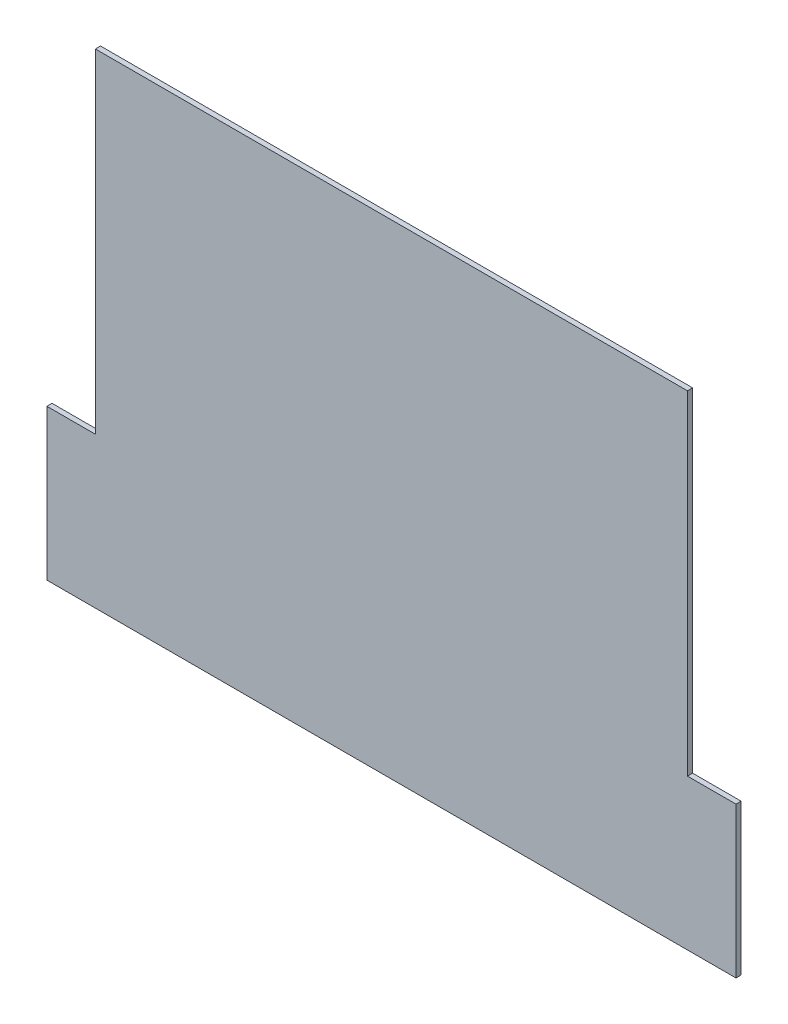
ISO-10303-21;
HEADER;
FILE_DESCRIPTION(('STEP AP214'),'2;1');
FILE_NAME('part.step','',(''),(''),'','','');
FILE_SCHEMA(('AUTOMOTIVE_DESIGN { 1 0 10303 214 1 1 1 1 }'));
ENDSEC;
DATA;
#1=APPLICATION_CONTEXT('core data for automotive mechanical design processes');
#2=APPLICATION_PROTOCOL_DEFINITION('international standard','automotive_design',2000,#1);
#3=PRODUCT_CONTEXT('',#1,'mechanical');
#4=PRODUCT('Part','Part','',(#3));
#5=PRODUCT_RELATED_PRODUCT_CATEGORY('part','',(#4));
#6=PRODUCT_DEFINITION_FORMATION('','',#4);
#7=PRODUCT_DEFINITION_CONTEXT('part definition',#1,'design');
#8=PRODUCT_DEFINITION('design','',#6,#7);
#9=PRODUCT_DEFINITION_SHAPE('','',#8);
#10=(LENGTH_UNIT() NAMED_UNIT(*) SI_UNIT(.MILLI.,.METRE.));
#11=(NAMED_UNIT(*) PLANE_ANGLE_UNIT() SI_UNIT($,.RADIAN.));
#12=(NAMED_UNIT(*) SI_UNIT($,.STERADIAN.) SOLID_ANGLE_UNIT());
#13=UNCERTAINTY_MEASURE_WITH_UNIT(LENGTH_MEASURE(1.E-05),#10,'distance_accuracy_value','');
#14=(GEOMETRIC_REPRESENTATION_CONTEXT(3) GLOBAL_UNCERTAINTY_ASSIGNED_CONTEXT((#13)) GLOBAL_UNIT_ASSIGNED_CONTEXT((#10,
#11,#12)) REPRESENTATION_CONTEXT('',''));
#15=CARTESIAN_POINT('',(0.,0.,0.));
#16=DIRECTION('',(0.,0.,1.));
#17=DIRECTION('',(1.,0.,0.));
#18=AXIS2_PLACEMENT_3D('',#15,#16,#17);
#19=CARTESIAN_POINT('',(0.,0.,3.));
#20=DIRECTION('',(1.,0.,0.));
#21=DIRECTION('',(0.,0.,-1.));
#22=AXIS2_PLACEMENT_3D('',#19,#20,#21);
#23=PLANE('',#22);
#24=DIRECTION('',(0.,-1.,0.));
#25=VECTOR('',#24,1.);
#26=CARTESIAN_POINT('',(0.,0.,0.));
#27=LINE('',#26,#25);
#28=CARTESIAN_POINT('',(0.,87.9999999999999,0.));
#29=VERTEX_POINT('',#28);
#30=CARTESIAN_POINT('',(0.,0.,0.));
#31=VERTEX_POINT('',#30);
#32=EDGE_CURVE('E140',#29,#31,#27,.T.);
#33=ORIENTED_EDGE('',*,*,#32,.T.);
#34=DIRECTION('',(0.,0.,-1.));
#35=VECTOR('',#34,1.);
#36=CARTESIAN_POINT('',(0.,0.,3.));
#37=LINE('',#36,#35);
#38=CARTESIAN_POINT('',(0.,0.,3.));
#39=VERTEX_POINT('',#38);
#40=EDGE_CURVE('E11',#39,#31,#37,.T.);
#41=ORIENTED_EDGE('',*,*,#40,.F.);
#42=DIRECTION('',(0.,-1.,0.));
#43=VECTOR('',#42,1.);
#44=CARTESIAN_POINT('',(0.,0.,3.));
#45=LINE('',#44,#43);
#46=CARTESIAN_POINT('',(0.,87.9999999999999,3.));
#47=VERTEX_POINT('',#46);
#48=EDGE_CURVE('E162',#47,#39,#45,.T.);
#49=ORIENTED_EDGE('',*,*,#48,.F.);
#50=DIRECTION('',(0.,0.,-1.));
#51=VECTOR('',#50,1.);
#52=CARTESIAN_POINT('',(0.,87.9999999999999,3.));
#53=LINE('',#52,#51);
#54=EDGE_CURVE('E136',#47,#29,#53,.T.);
#55=ORIENTED_EDGE('',*,*,#54,.T.);
#56=EDGE_LOOP('',(#33,#41,#49,#55));
#57=FACE_BOUND('',#56,.T.);
#58=ADVANCED_FACE('F39',(#57),#23,.F.);
#59=CARTESIAN_POINT('',(0.,0.,3.));
#60=DIRECTION('',(0.,1.,0.));
#61=DIRECTION('',(0.,0.,1.));
#62=AXIS2_PLACEMENT_3D('',#59,#60,#61);
#63=PLANE('',#62);
#64=DIRECTION('',(1.,0.,0.));
#65=VECTOR('',#64,1.);
#66=CARTESIAN_POINT('',(0.,0.,0.));
#67=LINE('',#66,#65);
#68=CARTESIAN_POINT('',(402.7,0.,0.));
#69=VERTEX_POINT('',#68);
#70=EDGE_CURVE('E144',#31,#69,#67,.T.);
#71=ORIENTED_EDGE('',*,*,#70,.T.);
#72=DIRECTION('',(0.,0.,-1.));
#73=VECTOR('',#72,1.);
#74=CARTESIAN_POINT('',(402.7,0.,3.));
#75=LINE('',#74,#73);
#76=CARTESIAN_POINT('',(402.7,0.,3.));
#77=VERTEX_POINT('',#76);
#78=EDGE_CURVE('E48',#77,#69,#75,.T.);
#79=ORIENTED_EDGE('',*,*,#78,.F.);
#80=DIRECTION('',(1.,0.,0.));
#81=VECTOR('',#80,1.);
#82=CARTESIAN_POINT('',(0.,0.,3.));
#83=LINE('',#82,#81);
#84=EDGE_CURVE('E99',#39,#77,#83,.T.);
#85=ORIENTED_EDGE('',*,*,#84,.F.);
#86=ORIENTED_EDGE('',*,*,#40,.T.);
#87=EDGE_LOOP('',(#71,#79,#85,#86));
#88=FACE_BOUND('',#87,.T.);
#89=ADVANCED_FACE('F208',(#88),#63,.F.);
#90=CARTESIAN_POINT('',(402.7,0.,3.));
#91=DIRECTION('',(-1.,0.,0.));
#92=DIRECTION('',(0.,0.,1.));
#93=AXIS2_PLACEMENT_3D('',#90,#91,#92);
#94=PLANE('',#93);
#95=DIRECTION('',(0.,1.,0.));
#96=VECTOR('',#95,1.);
#97=CARTESIAN_POINT('',(402.7,0.,0.));
#98=LINE('',#97,#96);
#99=CARTESIAN_POINT('',(402.7,88.,0.));
#100=VERTEX_POINT('',#99);
#101=EDGE_CURVE('E147',#69,#100,#98,.T.);
#102=ORIENTED_EDGE('',*,*,#101,.T.);
#103=DIRECTION('',(0.,0.,-1.));
#104=VECTOR('',#103,1.);
#105=CARTESIAN_POINT('',(402.7,88.,3.));
#106=LINE('',#105,#104);
#107=CARTESIAN_POINT('',(402.7,88.,3.));
#108=VERTEX_POINT('',#107);
#109=EDGE_CURVE('E173',#108,#100,#106,.T.);
#110=ORIENTED_EDGE('',*,*,#109,.F.);
#111=DIRECTION('',(0.,1.,0.));
#112=VECTOR('',#111,1.);
#113=CARTESIAN_POINT('',(402.7,0.,3.));
#114=LINE('',#113,#112);
#115=EDGE_CURVE('E183',#77,#108,#114,.T.);
#116=ORIENTED_EDGE('',*,*,#115,.F.);
#117=ORIENTED_EDGE('',*,*,#78,.T.);
#118=EDGE_LOOP('',(#102,#110,#116,#117));
#119=FACE_BOUND('',#118,.T.);
#120=ADVANCED_FACE('F181',(#119),#94,.F.);
#121=CARTESIAN_POINT('',(402.7,88.,3.));
#122=DIRECTION('',(0.,-1.,0.));
#123=DIRECTION('',(1.,0.,0.));
#124=AXIS2_PLACEMENT_3D('',#121,#122,#123);
#125=PLANE('',#124);
#126=DIRECTION('',(-1.,0.,0.));
#127=VECTOR('',#126,1.);
#128=CARTESIAN_POINT('',(402.7,88.,0.));
#129=LINE('',#128,#127);
#130=CARTESIAN_POINT('',(374.35,88.,0.));
#131=VERTEX_POINT('',#130);
#132=EDGE_CURVE('E150',#100,#131,#129,.T.);
#133=ORIENTED_EDGE('',*,*,#132,.T.);
#134=DIRECTION('',(0.,0.,-1.));
#135=VECTOR('',#134,1.);
#136=CARTESIAN_POINT('',(374.35,88.,3.));
#137=LINE('',#136,#135);
#138=CARTESIAN_POINT('',(374.35,88.,3.));
#139=VERTEX_POINT('',#138);
#140=EDGE_CURVE('E169',#139,#131,#137,.T.);
#141=ORIENTED_EDGE('',*,*,#140,.F.);
#142=DIRECTION('',(-1.,0.,0.));
#143=VECTOR('',#142,1.);
#144=CARTESIAN_POINT('',(402.7,88.,3.));
#145=LINE('',#144,#143);
#146=EDGE_CURVE('E196',#108,#139,#145,.T.);
#147=ORIENTED_EDGE('',*,*,#146,.F.);
#148=ORIENTED_EDGE('',*,*,#109,.T.);
#149=EDGE_LOOP('',(#133,#141,#147,#148));
#150=FACE_BOUND('',#149,.T.);
#151=ADVANCED_FACE('F191',(#150),#125,.F.);
#152=CARTESIAN_POINT('',(374.35,283.,3.));
#153=DIRECTION('',(-1.,0.,0.));
#154=DIRECTION('',(0.,0.,1.));
#155=AXIS2_PLACEMENT_3D('',#152,#153,#154);
#156=PLANE('',#155);
#157=DIRECTION('',(0.,1.,0.));
#158=VECTOR('',#157,1.);
#159=CARTESIAN_POINT('',(374.35,283.,0.));
#160=LINE('',#159,#158);
#161=CARTESIAN_POINT('',(374.35,283.,0.));
#162=VERTEX_POINT('',#161);
#163=EDGE_CURVE('E153',#131,#162,#160,.T.);
#164=ORIENTED_EDGE('',*,*,#163,.T.);
#165=DIRECTION('',(0.,0.,-1.));
#166=VECTOR('',#165,1.);
#167=CARTESIAN_POINT('',(374.35,283.,3.));
#168=LINE('',#167,#166);
#169=CARTESIAN_POINT('',(374.35,283.,3.));
#170=VERTEX_POINT('',#169);
#171=EDGE_CURVE('E129',#170,#162,#168,.T.);
#172=ORIENTED_EDGE('',*,*,#171,.F.);
#173=DIRECTION('',(0.,1.,0.));
#174=VECTOR('',#173,1.);
#175=CARTESIAN_POINT('',(374.35,283.,3.));
#176=LINE('',#175,#174);
#177=EDGE_CURVE('E118',#139,#170,#176,.T.);
#178=ORIENTED_EDGE('',*,*,#177,.F.);
#179=ORIENTED_EDGE('',*,*,#140,.T.);
#180=EDGE_LOOP('',(#164,#172,#178,#179));
#181=FACE_BOUND('',#180,.T.);
#182=ADVANCED_FACE('F194',(#181),#156,.F.);
#183=CARTESIAN_POINT('',(28.35,283.,3.));
#184=DIRECTION('',(0.,-1.,0.));
#185=DIRECTION('',(0.,0.,-1.));
#186=AXIS2_PLACEMENT_3D('',#183,#184,#185);
#187=PLANE('',#186);
#188=DIRECTION('',(-1.,0.,0.));
#189=VECTOR('',#188,1.);
#190=CARTESIAN_POINT('',(28.35,283.,0.));
#191=LINE('',#190,#189);
#192=CARTESIAN_POINT('',(28.35,283.,0.));
#193=VERTEX_POINT('',#192);
#194=EDGE_CURVE('E127',#162,#193,#191,.T.);
#195=ORIENTED_EDGE('',*,*,#194,.T.);
#196=DIRECTION('',(0.,0.,-1.));
#197=VECTOR('',#196,1.);
#198=CARTESIAN_POINT('',(28.35,283.,3.));
#199=LINE('',#198,#197);
#200=CARTESIAN_POINT('',(28.35,283.,3.));
#201=VERTEX_POINT('',#200);
#202=EDGE_CURVE('E124',#201,#193,#199,.T.);
#203=ORIENTED_EDGE('',*,*,#202,.F.);
#204=DIRECTION('',(-1.,0.,0.));
#205=VECTOR('',#204,1.);
#206=CARTESIAN_POINT('',(28.35,283.,3.));
#207=LINE('',#206,#205);
#208=EDGE_CURVE('E112',#170,#201,#207,.T.);
#209=ORIENTED_EDGE('',*,*,#208,.F.);
#210=ORIENTED_EDGE('',*,*,#171,.T.);
#211=EDGE_LOOP('',(#195,#203,#209,#210));
#212=FACE_BOUND('',#211,.T.);
#213=ADVANCED_FACE('F125',(#212),#187,.F.);
#214=CARTESIAN_POINT('',(28.35,283.,3.));
#215=DIRECTION('',(1.,0.,0.));
#216=DIRECTION('',(0.,1.,0.));
#217=AXIS2_PLACEMENT_3D('',#214,#215,#216);
#218=PLANE('',#217);
#219=DIRECTION('',(0.,-1.,0.));
#220=VECTOR('',#219,1.);
#221=CARTESIAN_POINT('',(28.35,283.,0.));
#222=LINE('',#221,#220);
#223=CARTESIAN_POINT('',(28.35,87.9999999999999,0.));
#224=VERTEX_POINT('',#223);
#225=EDGE_CURVE('E85',#193,#224,#222,.T.);
#226=ORIENTED_EDGE('',*,*,#225,.T.);
#227=DIRECTION('',(0.,0.,-1.));
#228=VECTOR('',#227,1.);
#229=CARTESIAN_POINT('',(28.35,87.9999999999999,3.));
#230=LINE('',#229,#228);
#231=CARTESIAN_POINT('',(28.35,87.9999999999999,3.));
#232=VERTEX_POINT('',#231);
#233=EDGE_CURVE('E130',#232,#224,#230,.T.);
#234=ORIENTED_EDGE('',*,*,#233,.F.);
#235=DIRECTION('',(0.,-1.,0.));
#236=VECTOR('',#235,1.);
#237=CARTESIAN_POINT('',(28.35,283.,3.));
#238=LINE('',#237,#236);
#239=EDGE_CURVE('E116',#201,#232,#238,.T.);
#240=ORIENTED_EDGE('',*,*,#239,.F.);
#241=ORIENTED_EDGE('',*,*,#202,.T.);
#242=EDGE_LOOP('',(#226,#234,#240,#241));
#243=FACE_BOUND('',#242,.T.);
#244=ADVANCED_FACE('F132',(#243),#218,.F.);
#245=CARTESIAN_POINT('',(0.,87.9999999999999,3.));
#246=DIRECTION('',(0.,-1.,0.));
#247=DIRECTION('',(0.,0.,-1.));
#248=AXIS2_PLACEMENT_3D('',#245,#246,#247);
#249=PLANE('',#248);
#250=DIRECTION('',(-1.,0.,0.));
#251=VECTOR('',#250,1.);
#252=CARTESIAN_POINT('',(0.,87.9999999999999,0.));
#253=LINE('',#252,#251);
#254=EDGE_CURVE('E91',#224,#29,#253,.T.);
#255=ORIENTED_EDGE('',*,*,#254,.T.);
#256=ORIENTED_EDGE('',*,*,#54,.F.);
#257=DIRECTION('',(-1.,0.,0.));
#258=VECTOR('',#257,1.);
#259=CARTESIAN_POINT('',(0.,87.9999999999999,3.));
#260=LINE('',#259,#258);
#261=EDGE_CURVE('E56',#232,#47,#260,.T.);
#262=ORIENTED_EDGE('',*,*,#261,.F.);
#263=ORIENTED_EDGE('',*,*,#233,.T.);
#264=EDGE_LOOP('',(#255,#256,#262,#263));
#265=FACE_BOUND('',#264,.T.);
#266=ADVANCED_FACE('F224',(#265),#249,.F.);
#267=CARTESIAN_POINT('',(0.,0.,3.));
#268=DIRECTION('',(0.,0.,-1.));
#269=DIRECTION('',(-1.,0.,0.));
#270=AXIS2_PLACEMENT_3D('',#267,#268,#269);
#271=PLANE('',#270);
#272=ORIENTED_EDGE('',*,*,#48,.T.);
#273=ORIENTED_EDGE('',*,*,#84,.T.);
#274=ORIENTED_EDGE('',*,*,#115,.T.);
#275=ORIENTED_EDGE('',*,*,#146,.T.);
#276=ORIENTED_EDGE('',*,*,#177,.T.);
#277=ORIENTED_EDGE('',*,*,#208,.T.);
#278=ORIENTED_EDGE('',*,*,#239,.T.);
#279=ORIENTED_EDGE('',*,*,#261,.T.);
#280=EDGE_LOOP('',(#272,#273,#274,#275,#276,#277,#278,#279));
#281=FACE_BOUND('',#280,.T.);
#282=ADVANCED_FACE('F114',(#281),#271,.F.);
#283=CARTESIAN_POINT('',(0.,0.,0.));
#284=DIRECTION('',(0.,0.,-1.));
#285=DIRECTION('',(-1.,0.,0.));
#286=AXIS2_PLACEMENT_3D('',#283,#284,#285);
#287=PLANE('',#286);
#288=ORIENTED_EDGE('',*,*,#32,.F.);
#289=ORIENTED_EDGE('',*,*,#254,.F.);
#290=ORIENTED_EDGE('',*,*,#225,.F.);
#291=ORIENTED_EDGE('',*,*,#194,.F.);
#292=ORIENTED_EDGE('',*,*,#163,.F.);
#293=ORIENTED_EDGE('',*,*,#132,.F.);
#294=ORIENTED_EDGE('',*,*,#101,.F.);
#295=ORIENTED_EDGE('',*,*,#70,.F.);
#296=EDGE_LOOP('',(#288,#289,#290,#291,#292,#293,#294,#295));
#297=FACE_BOUND('',#296,.T.);
#298=ADVANCED_FACE('F187',(#297),#287,.T.);
#299=CLOSED_SHELL('',(#58,#89,#120,#151,#182,#213,#244,#266,#282,#298));
#300=MANIFOLD_SOLID_BREP('B2',#299);
#301=ADVANCED_BREP_SHAPE_REPRESENTATION('',(#18,#300),#14);
#302=SHAPE_DEFINITION_REPRESENTATION(#9,#301);
ENDSEC;
END-ISO-10303-21;
